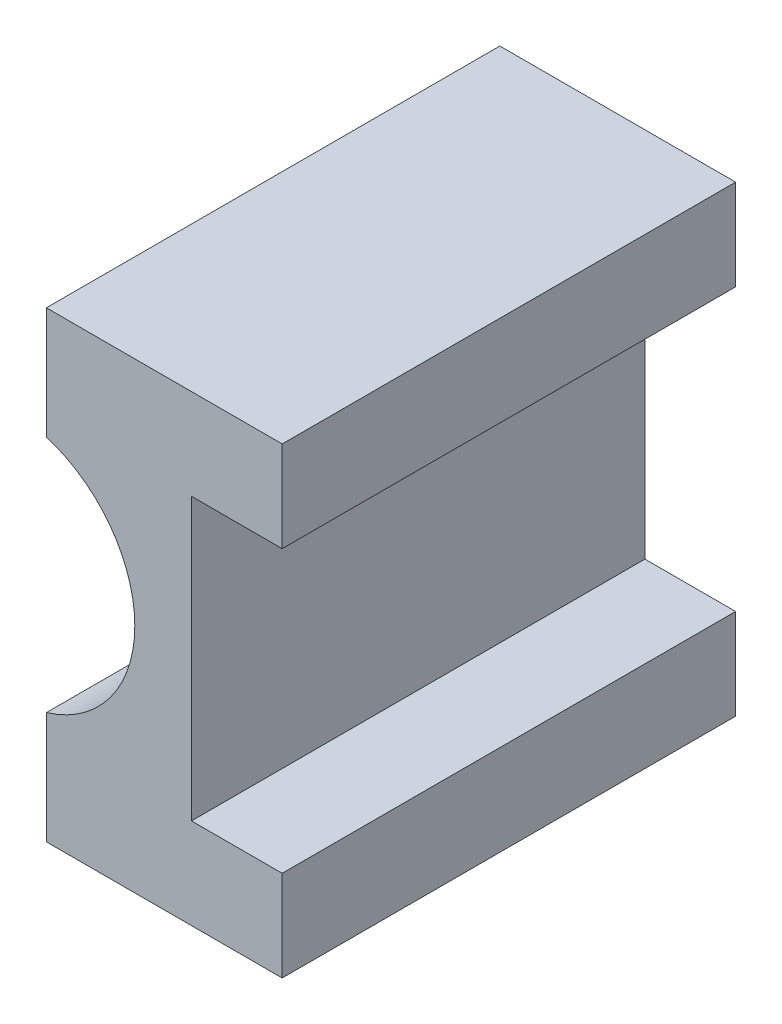
ISO-10303-21;
HEADER;
FILE_DESCRIPTION(('STEP AP214'),'2;1');
FILE_NAME('part.step','',(''),(''),'','','');
FILE_SCHEMA(('AUTOMOTIVE_DESIGN { 1 0 10303 214 1 1 1 1 }'));
ENDSEC;
DATA;
#1=APPLICATION_CONTEXT('core data for automotive mechanical design processes');
#2=APPLICATION_PROTOCOL_DEFINITION('international standard','automotive_design',2000,#1);
#3=PRODUCT_CONTEXT('',#1,'mechanical');
#4=PRODUCT('Part','Part','',(#3));
#5=PRODUCT_RELATED_PRODUCT_CATEGORY('part','',(#4));
#6=PRODUCT_DEFINITION_FORMATION('','',#4);
#7=PRODUCT_DEFINITION_CONTEXT('part definition',#1,'design');
#8=PRODUCT_DEFINITION('design','',#6,#7);
#9=PRODUCT_DEFINITION_SHAPE('','',#8);
#10=(LENGTH_UNIT() NAMED_UNIT(*) SI_UNIT(.MILLI.,.METRE.));
#11=(NAMED_UNIT(*) PLANE_ANGLE_UNIT() SI_UNIT($,.RADIAN.));
#12=(NAMED_UNIT(*) SI_UNIT($,.STERADIAN.) SOLID_ANGLE_UNIT());
#13=UNCERTAINTY_MEASURE_WITH_UNIT(LENGTH_MEASURE(1.E-05),#10,'distance_accuracy_value','');
#14=(GEOMETRIC_REPRESENTATION_CONTEXT(3) GLOBAL_UNCERTAINTY_ASSIGNED_CONTEXT((#13)) GLOBAL_UNIT_ASSIGNED_CONTEXT((#10,
#11,#12)) REPRESENTATION_CONTEXT('',''));
#15=CARTESIAN_POINT('',(0.,0.,0.));
#16=DIRECTION('',(0.,0.,1.));
#17=DIRECTION('',(1.,0.,0.));
#18=AXIS2_PLACEMENT_3D('',#15,#16,#17);
#19=CARTESIAN_POINT('',(6.,3.1,10.));
#20=DIRECTION('',(-1.,0.,0.));
#21=DIRECTION('',(0.,0.,1.));
#22=AXIS2_PLACEMENT_3D('',#19,#20,#21);
#23=PLANE('',#22);
#24=DIRECTION('',(0.,1.,0.));
#25=VECTOR('',#24,1.);
#26=CARTESIAN_POINT('',(6.,3.1,0.));
#27=LINE('',#26,#25);
#28=CARTESIAN_POINT('',(6.,3.1,0.));
#29=VERTEX_POINT('',#28);
#30=CARTESIAN_POINT('',(6.,5.1,0.));
#31=VERTEX_POINT('',#30);
#32=EDGE_CURVE('E141',#29,#31,#27,.T.);
#33=ORIENTED_EDGE('',*,*,#32,.T.);
#34=DIRECTION('',(0.,0.,-1.));
#35=VECTOR('',#34,1.);
#36=CARTESIAN_POINT('',(6.,5.1,10.));
#37=LINE('',#36,#35);
#38=CARTESIAN_POINT('',(6.,5.1,10.));
#39=VERTEX_POINT('',#38);
#40=EDGE_CURVE('E11',#39,#31,#37,.T.);
#41=ORIENTED_EDGE('',*,*,#40,.F.);
#42=DIRECTION('',(0.,1.,0.));
#43=VECTOR('',#42,1.);
#44=CARTESIAN_POINT('',(6.,3.1,10.));
#45=LINE('',#44,#43);
#46=CARTESIAN_POINT('',(6.,3.1,10.));
#47=VERTEX_POINT('',#46);
#48=EDGE_CURVE('E161',#47,#39,#45,.T.);
#49=ORIENTED_EDGE('',*,*,#48,.F.);
#50=DIRECTION('',(0.,0.,-1.));
#51=VECTOR('',#50,1.);
#52=CARTESIAN_POINT('',(6.,3.1,10.));
#53=LINE('',#52,#51);
#54=EDGE_CURVE('E137',#47,#29,#53,.T.);
#55=ORIENTED_EDGE('',*,*,#54,.T.);
#56=EDGE_LOOP('',(#33,#41,#49,#55));
#57=FACE_BOUND('',#56,.T.);
#58=ADVANCED_FACE('F33',(#57),#23,.F.);
#59=CARTESIAN_POINT('',(0.8,5.1,10.));
#60=DIRECTION('',(0.,-1.,0.));
#61=DIRECTION('',(0.,0.,-1.));
#62=AXIS2_PLACEMENT_3D('',#59,#60,#61);
#63=PLANE('',#62);
#64=DIRECTION('',(-1.,0.,0.));
#65=VECTOR('',#64,1.);
#66=CARTESIAN_POINT('',(0.8,5.1,0.));
#67=LINE('',#66,#65);
#68=CARTESIAN_POINT('',(0.8,5.1,0.));
#69=VERTEX_POINT('',#68);
#70=EDGE_CURVE('E144',#31,#69,#67,.T.);
#71=ORIENTED_EDGE('',*,*,#70,.T.);
#72=DIRECTION('',(0.,0.,-1.));
#73=VECTOR('',#72,1.);
#74=CARTESIAN_POINT('',(0.8,5.1,10.));
#75=LINE('',#74,#73);
#76=CARTESIAN_POINT('',(0.8,5.1,10.));
#77=VERTEX_POINT('',#76);
#78=EDGE_CURVE('E41',#77,#69,#75,.T.);
#79=ORIENTED_EDGE('',*,*,#78,.F.);
#80=DIRECTION('',(-1.,0.,0.));
#81=VECTOR('',#80,1.);
#82=CARTESIAN_POINT('',(0.8,5.1,10.));
#83=LINE('',#82,#81);
#84=EDGE_CURVE('E98',#39,#77,#83,.T.);
#85=ORIENTED_EDGE('',*,*,#84,.F.);
#86=ORIENTED_EDGE('',*,*,#40,.T.);
#87=EDGE_LOOP('',(#71,#79,#85,#86));
#88=FACE_BOUND('',#87,.T.);
#89=ADVANCED_FACE('F182',(#88),#63,.F.);
#90=CARTESIAN_POINT('',(0.8,3.,10.));
#91=DIRECTION('',(1.,0.,0.));
#92=DIRECTION('',(0.,1.,0.));
#93=AXIS2_PLACEMENT_3D('',#90,#91,#92);
#94=PLANE('',#93);
#95=DIRECTION('',(0.,-1.,0.));
#96=VECTOR('',#95,1.);
#97=CARTESIAN_POINT('',(0.8,3.,0.));
#98=LINE('',#97,#96);
#99=CARTESIAN_POINT('',(0.8,2.63106442338457,0.));
#100=VERTEX_POINT('',#99);
#101=EDGE_CURVE('E147',#69,#100,#98,.T.);
#102=ORIENTED_EDGE('',*,*,#101,.T.);
#103=DIRECTION('',(0.,0.,-1.));
#104=VECTOR('',#103,1.);
#105=CARTESIAN_POINT('',(0.8,2.63106442338457,10.));
#106=LINE('',#105,#104);
#107=CARTESIAN_POINT('',(0.8,2.63106442338457,10.));
#108=VERTEX_POINT('',#107);
#109=EDGE_CURVE('E174',#108,#100,#106,.T.);
#110=ORIENTED_EDGE('',*,*,#109,.F.);
#111=DIRECTION('',(0.,-1.,0.));
#112=VECTOR('',#111,1.);
#113=CARTESIAN_POINT('',(0.8,3.,10.));
#114=LINE('',#113,#112);
#115=EDGE_CURVE('E181',#77,#108,#114,.T.);
#116=ORIENTED_EDGE('',*,*,#115,.F.);
#117=ORIENTED_EDGE('',*,*,#78,.T.);
#118=EDGE_LOOP('',(#102,#110,#116,#117));
#119=FACE_BOUND('',#118,.T.);
#120=ADVANCED_FACE('F179',(#119),#94,.F.);
#121=CARTESIAN_POINT('',(0.,0.,10.));
#122=DIRECTION('',(0.,0.,-1.));
#123=DIRECTION('',(-1.,0.,0.));
#124=AXIS2_PLACEMENT_3D('',#121,#122,#123);
#125=CYLINDRICAL_SURFACE('',#124,2.75);
#126=CARTESIAN_POINT('',(0.,0.,0.));
#127=DIRECTION('',(0.,0.,-1.));
#128=DIRECTION('',(1.,0.,0.));
#129=AXIS2_PLACEMENT_3D('',#126,#127,#128);
#130=CIRCLE('',#129,2.75);
#131=CARTESIAN_POINT('',(0.799999999999999,-2.63106442338457,0.));
#132=VERTEX_POINT('',#131);
#133=EDGE_CURVE('E149',#100,#132,#130,.T.);
#134=ORIENTED_EDGE('',*,*,#133,.T.);
#135=DIRECTION('',(0.,0.,-1.));
#136=VECTOR('',#135,1.);
#137=CARTESIAN_POINT('',(0.799999999999999,-2.63106442338457,10.));
#138=LINE('',#137,#136);
#139=CARTESIAN_POINT('',(0.799999999999999,-2.63106442338457,10.));
#140=VERTEX_POINT('',#139);
#141=EDGE_CURVE('E171',#140,#132,#138,.T.);
#142=ORIENTED_EDGE('',*,*,#141,.F.);
#143=CARTESIAN_POINT('',(0.,0.,10.));
#144=DIRECTION('',(0.,0.,-1.));
#145=DIRECTION('',(1.,0.,0.));
#146=AXIS2_PLACEMENT_3D('',#143,#144,#145);
#147=CIRCLE('',#146,2.75);
#148=EDGE_CURVE('E200',#108,#140,#147,.T.);
#149=ORIENTED_EDGE('',*,*,#148,.F.);
#150=ORIENTED_EDGE('',*,*,#109,.T.);
#151=EDGE_LOOP('',(#134,#142,#149,#150));
#152=FACE_BOUND('',#151,.T.);
#153=ADVANCED_FACE('F191',(#152),#125,.F.);
#154=CARTESIAN_POINT('',(0.8,-3.,10.));
#155=DIRECTION('',(1.,0.,0.));
#156=DIRECTION('',(0.,1.,0.));
#157=AXIS2_PLACEMENT_3D('',#154,#155,#156);
#158=PLANE('',#157);
#159=DIRECTION('',(0.,-1.,0.));
#160=VECTOR('',#159,1.);
#161=CARTESIAN_POINT('',(0.8,-3.,0.));
#162=LINE('',#161,#160);
#163=CARTESIAN_POINT('',(0.800000000000001,-5.1,0.));
#164=VERTEX_POINT('',#163);
#165=EDGE_CURVE('E152',#132,#164,#162,.T.);
#166=ORIENTED_EDGE('',*,*,#165,.T.);
#167=DIRECTION('',(0.,0.,-1.));
#168=VECTOR('',#167,1.);
#169=CARTESIAN_POINT('',(0.800000000000001,-5.1,10.));
#170=LINE('',#169,#168);
#171=CARTESIAN_POINT('',(0.800000000000001,-5.1,10.));
#172=VERTEX_POINT('',#171);
#173=EDGE_CURVE('E168',#172,#164,#170,.T.);
#174=ORIENTED_EDGE('',*,*,#173,.F.);
#175=DIRECTION('',(0.,-1.,0.));
#176=VECTOR('',#175,1.);
#177=CARTESIAN_POINT('',(0.8,-2.63106442338457,10.));
#178=LINE('',#177,#176);
#179=EDGE_CURVE('E197',#140,#172,#178,.T.);
#180=ORIENTED_EDGE('',*,*,#179,.F.);
#181=ORIENTED_EDGE('',*,*,#141,.T.);
#182=EDGE_LOOP('',(#166,#174,#180,#181));
#183=FACE_BOUND('',#182,.T.);
#184=ADVANCED_FACE('F195',(#183),#158,.F.);
#185=CARTESIAN_POINT('',(0.800000000000001,-5.1,10.));
#186=DIRECTION('',(0.,1.,0.));
#187=DIRECTION('',(0.,0.,1.));
#188=AXIS2_PLACEMENT_3D('',#185,#186,#187);
#189=PLANE('',#188);
#190=DIRECTION('',(1.,0.,0.));
#191=VECTOR('',#190,1.);
#192=CARTESIAN_POINT('',(0.800000000000001,-5.1,0.));
#193=LINE('',#192,#191);
#194=CARTESIAN_POINT('',(6.,-5.1,0.));
#195=VERTEX_POINT('',#194);
#196=EDGE_CURVE('E154',#164,#195,#193,.T.);
#197=ORIENTED_EDGE('',*,*,#196,.T.);
#198=DIRECTION('',(0.,0.,-1.));
#199=VECTOR('',#198,1.);
#200=CARTESIAN_POINT('',(6.,-5.1,10.));
#201=LINE('',#200,#199);
#202=CARTESIAN_POINT('',(6.,-5.1,10.));
#203=VERTEX_POINT('',#202);
#204=EDGE_CURVE('E165',#203,#195,#201,.T.);
#205=ORIENTED_EDGE('',*,*,#204,.F.);
#206=DIRECTION('',(1.,0.,0.));
#207=VECTOR('',#206,1.);
#208=CARTESIAN_POINT('',(0.800000000000001,-5.1,10.));
#209=LINE('',#208,#207);
#210=EDGE_CURVE('E199',#172,#203,#209,.T.);
#211=ORIENTED_EDGE('',*,*,#210,.F.);
#212=ORIENTED_EDGE('',*,*,#173,.T.);
#213=EDGE_LOOP('',(#197,#205,#211,#212));
#214=FACE_BOUND('',#213,.T.);
#215=ADVANCED_FACE('F215',(#214),#189,.F.);
#216=CARTESIAN_POINT('',(6.,-5.1,10.));
#217=DIRECTION('',(-1.,0.,0.));
#218=DIRECTION('',(0.,0.,1.));
#219=AXIS2_PLACEMENT_3D('',#216,#217,#218);
#220=PLANE('',#219);
#221=DIRECTION('',(0.,1.,0.));
#222=VECTOR('',#221,1.);
#223=CARTESIAN_POINT('',(6.,-5.1,0.));
#224=LINE('',#223,#222);
#225=CARTESIAN_POINT('',(6.,-3.1,0.));
#226=VERTEX_POINT('',#225);
#227=EDGE_CURVE('E156',#195,#226,#224,.T.);
#228=ORIENTED_EDGE('',*,*,#227,.T.);
#229=DIRECTION('',(0.,0.,-1.));
#230=VECTOR('',#229,1.);
#231=CARTESIAN_POINT('',(6.,-3.1,10.));
#232=LINE('',#231,#230);
#233=CARTESIAN_POINT('',(6.,-3.1,10.));
#234=VERTEX_POINT('',#233);
#235=EDGE_CURVE('E132',#234,#226,#232,.T.);
#236=ORIENTED_EDGE('',*,*,#235,.F.);
#237=DIRECTION('',(0.,1.,0.));
#238=VECTOR('',#237,1.);
#239=CARTESIAN_POINT('',(6.,-5.1,10.));
#240=LINE('',#239,#238);
#241=EDGE_CURVE('E123',#203,#234,#240,.T.);
#242=ORIENTED_EDGE('',*,*,#241,.F.);
#243=ORIENTED_EDGE('',*,*,#204,.T.);
#244=EDGE_LOOP('',(#228,#236,#242,#243));
#245=FACE_BOUND('',#244,.T.);
#246=ADVANCED_FACE('F212',(#245),#220,.F.);
#247=CARTESIAN_POINT('',(6.,-3.1,10.));
#248=DIRECTION('',(0.,-1.,0.));
#249=DIRECTION('',(1.,0.,0.));
#250=AXIS2_PLACEMENT_3D('',#247,#248,#249);
#251=PLANE('',#250);
#252=DIRECTION('',(-1.,0.,0.));
#253=VECTOR('',#252,1.);
#254=CARTESIAN_POINT('',(6.,-3.1,0.));
#255=LINE('',#254,#253);
#256=CARTESIAN_POINT('',(4.,-3.1,0.));
#257=VERTEX_POINT('',#256);
#258=EDGE_CURVE('E131',#226,#257,#255,.T.);
#259=ORIENTED_EDGE('',*,*,#258,.T.);
#260=DIRECTION('',(0.,0.,-1.));
#261=VECTOR('',#260,1.);
#262=CARTESIAN_POINT('',(4.,-3.1,10.));
#263=LINE('',#262,#261);
#264=CARTESIAN_POINT('',(4.,-3.1,10.));
#265=VERTEX_POINT('',#264);
#266=EDGE_CURVE('E128',#265,#257,#263,.T.);
#267=ORIENTED_EDGE('',*,*,#266,.F.);
#268=DIRECTION('',(-1.,0.,0.));
#269=VECTOR('',#268,1.);
#270=CARTESIAN_POINT('',(6.,-3.1,10.));
#271=LINE('',#270,#269);
#272=EDGE_CURVE('E117',#234,#265,#271,.T.);
#273=ORIENTED_EDGE('',*,*,#272,.F.);
#274=ORIENTED_EDGE('',*,*,#235,.T.);
#275=EDGE_LOOP('',(#259,#267,#273,#274));
#276=FACE_BOUND('',#275,.T.);
#277=ADVANCED_FACE('F129',(#276),#251,.F.);
#278=CARTESIAN_POINT('',(4.,-3.1,10.));
#279=DIRECTION('',(-1.,0.,0.));
#280=DIRECTION('',(0.,0.,1.));
#281=AXIS2_PLACEMENT_3D('',#278,#279,#280);
#282=PLANE('',#281);
#283=DIRECTION('',(0.,1.,0.));
#284=VECTOR('',#283,1.);
#285=CARTESIAN_POINT('',(4.,-3.1,0.));
#286=LINE('',#285,#284);
#287=CARTESIAN_POINT('',(4.,3.1,0.));
#288=VERTEX_POINT('',#287);
#289=EDGE_CURVE('E84',#257,#288,#286,.T.);
#290=ORIENTED_EDGE('',*,*,#289,.T.);
#291=DIRECTION('',(0.,0.,-1.));
#292=VECTOR('',#291,1.);
#293=CARTESIAN_POINT('',(4.,3.1,10.));
#294=LINE('',#293,#292);
#295=CARTESIAN_POINT('',(4.,3.1,10.));
#296=VERTEX_POINT('',#295);
#297=EDGE_CURVE('E133',#296,#288,#294,.T.);
#298=ORIENTED_EDGE('',*,*,#297,.F.);
#299=DIRECTION('',(0.,1.,0.));
#300=VECTOR('',#299,1.);
#301=CARTESIAN_POINT('',(4.,-3.1,10.));
#302=LINE('',#301,#300);
#303=EDGE_CURVE('E121',#265,#296,#302,.T.);
#304=ORIENTED_EDGE('',*,*,#303,.F.);
#305=ORIENTED_EDGE('',*,*,#266,.T.);
#306=EDGE_LOOP('',(#290,#298,#304,#305));
#307=FACE_BOUND('',#306,.T.);
#308=ADVANCED_FACE('F135',(#307),#282,.F.);
#309=CARTESIAN_POINT('',(4.,3.1,10.));
#310=DIRECTION('',(0.,1.,0.));
#311=DIRECTION('',(0.,0.,1.));
#312=AXIS2_PLACEMENT_3D('',#309,#310,#311);
#313=PLANE('',#312);
#314=DIRECTION('',(1.,0.,0.));
#315=VECTOR('',#314,1.);
#316=CARTESIAN_POINT('',(4.,3.1,0.));
#317=LINE('',#316,#315);
#318=EDGE_CURVE('E90',#288,#29,#317,.T.);
#319=ORIENTED_EDGE('',*,*,#318,.T.);
#320=ORIENTED_EDGE('',*,*,#54,.F.);
#321=DIRECTION('',(1.,0.,0.));
#322=VECTOR('',#321,1.);
#323=CARTESIAN_POINT('',(4.,3.1,10.));
#324=LINE('',#323,#322);
#325=EDGE_CURVE('E49',#296,#47,#324,.T.);
#326=ORIENTED_EDGE('',*,*,#325,.F.);
#327=ORIENTED_EDGE('',*,*,#297,.T.);
#328=EDGE_LOOP('',(#319,#320,#326,#327));
#329=FACE_BOUND('',#328,.T.);
#330=ADVANCED_FACE('F209',(#329),#313,.F.);
#331=CARTESIAN_POINT('',(0.,0.,10.));
#332=DIRECTION('',(0.,0.,1.));
#333=DIRECTION('',(1.,0.,0.));
#334=AXIS2_PLACEMENT_3D('',#331,#332,#333);
#335=PLANE('',#334);
#336=ORIENTED_EDGE('',*,*,#48,.T.);
#337=ORIENTED_EDGE('',*,*,#84,.T.);
#338=ORIENTED_EDGE('',*,*,#115,.T.);
#339=ORIENTED_EDGE('',*,*,#148,.T.);
#340=ORIENTED_EDGE('',*,*,#179,.T.);
#341=ORIENTED_EDGE('',*,*,#210,.T.);
#342=ORIENTED_EDGE('',*,*,#241,.T.);
#343=ORIENTED_EDGE('',*,*,#272,.T.);
#344=ORIENTED_EDGE('',*,*,#303,.T.);
#345=ORIENTED_EDGE('',*,*,#325,.T.);
#346=EDGE_LOOP('',(#336,#337,#338,#339,#340,#341,#342,#343,#344,#345));
#347=FACE_BOUND('',#346,.T.);
#348=ADVANCED_FACE('F119',(#347),#335,.T.);
#349=CARTESIAN_POINT('',(0.,0.,0.));
#350=DIRECTION('',(0.,0.,1.));
#351=DIRECTION('',(1.,0.,0.));
#352=AXIS2_PLACEMENT_3D('',#349,#350,#351);
#353=PLANE('',#352);
#354=ORIENTED_EDGE('',*,*,#32,.F.);
#355=ORIENTED_EDGE('',*,*,#318,.F.);
#356=ORIENTED_EDGE('',*,*,#289,.F.);
#357=ORIENTED_EDGE('',*,*,#258,.F.);
#358=ORIENTED_EDGE('',*,*,#227,.F.);
#359=ORIENTED_EDGE('',*,*,#196,.F.);
#360=ORIENTED_EDGE('',*,*,#165,.F.);
#361=ORIENTED_EDGE('',*,*,#133,.F.);
#362=ORIENTED_EDGE('',*,*,#101,.F.);
#363=ORIENTED_EDGE('',*,*,#70,.F.);
#364=EDGE_LOOP('',(#354,#355,#356,#357,#358,#359,#360,#361,#362,#363));
#365=FACE_BOUND('',#364,.T.);
#366=ADVANCED_FACE('F186',(#365),#353,.F.);
#367=CLOSED_SHELL('',(#58,#89,#120,#153,#184,#215,#246,#277,#308,#330,#348,#366));
#368=MANIFOLD_SOLID_BREP('B2',#367);
#369=ADVANCED_BREP_SHAPE_REPRESENTATION('',(#18,#368),#14);
#370=SHAPE_DEFINITION_REPRESENTATION(#9,#369);
ENDSEC;
END-ISO-10303-21;
